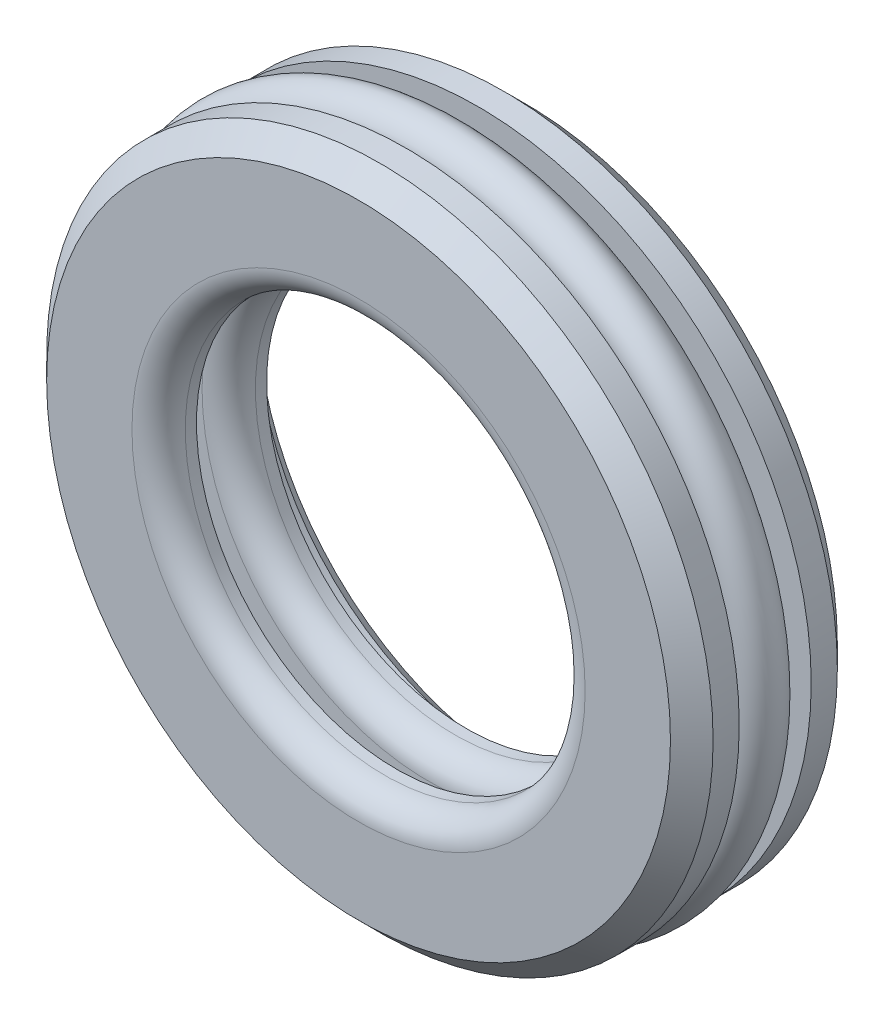
ISO-10303-21;
HEADER;
FILE_DESCRIPTION(('STEP AP214'),'2;1');
FILE_NAME('part.step','',(''),(''),'','','');
FILE_SCHEMA(('AUTOMOTIVE_DESIGN { 1 0 10303 214 1 1 1 1 }'));
ENDSEC;
DATA;
#1=APPLICATION_CONTEXT('core data for automotive mechanical design processes');
#2=APPLICATION_PROTOCOL_DEFINITION('international standard','automotive_design',2000,#1);
#3=PRODUCT_CONTEXT('',#1,'mechanical');
#4=PRODUCT('Part','Part','',(#3));
#5=PRODUCT_RELATED_PRODUCT_CATEGORY('part','',(#4));
#6=PRODUCT_DEFINITION_FORMATION('','',#4);
#7=PRODUCT_DEFINITION_CONTEXT('part definition',#1,'design');
#8=PRODUCT_DEFINITION('design','',#6,#7);
#9=PRODUCT_DEFINITION_SHAPE('','',#8);
#10=(LENGTH_UNIT() NAMED_UNIT(*) SI_UNIT(.MILLI.,.METRE.));
#11=(NAMED_UNIT(*) PLANE_ANGLE_UNIT() SI_UNIT($,.RADIAN.));
#12=(NAMED_UNIT(*) SI_UNIT($,.STERADIAN.) SOLID_ANGLE_UNIT());
#13=UNCERTAINTY_MEASURE_WITH_UNIT(LENGTH_MEASURE(1.E-05),#10,'distance_accuracy_value','');
#14=(GEOMETRIC_REPRESENTATION_CONTEXT(3) GLOBAL_UNCERTAINTY_ASSIGNED_CONTEXT((#13)) GLOBAL_UNIT_ASSIGNED_CONTEXT((#10,
#11,#12)) REPRESENTATION_CONTEXT('',''));
#15=CARTESIAN_POINT('',(0.,0.,0.));
#16=DIRECTION('',(0.,0.,1.));
#17=DIRECTION('',(1.,0.,0.));
#18=AXIS2_PLACEMENT_3D('',#15,#16,#17);
#19=CARTESIAN_POINT('',(0.,0.,0.));
#20=DIRECTION('',(0.,0.,1.));
#21=DIRECTION('',(1.,0.,0.));
#22=AXIS2_PLACEMENT_3D('',#19,#20,#21);
#23=TOROIDAL_SURFACE('',#22,14.9606,1.143);
#24=CARTESIAN_POINT('',(16.1036,0.,0.));
#25=VERTEX_POINT('',#24);
#26=VERTEX_LOOP('',#25);
#27=FACE_BOUND('',#26,.T.);
#28=ADVANCED_FACE('F45',(#27),#23,.T.);
#29=CLOSED_SHELL('',(#28));
#30=MANIFOLD_SOLID_BREP('B2',#29);
#31=CARTESIAN_POINT('',(0.,0.,3.9751));
#32=DIRECTION('',(0.,0.,1.));
#33=DIRECTION('',(1.,0.,0.));
#34=AXIS2_PLACEMENT_3D('',#31,#32,#33);
#35=CYLINDRICAL_SURFACE('',#34,15.875);
#36=CARTESIAN_POINT('',(0.,0.,2.9591));
#37=DIRECTION('',(0.,0.,1.));
#38=DIRECTION('',(1.,0.,0.));
#39=AXIS2_PLACEMENT_3D('',#36,#37,#38);
#40=CIRCLE('',#39,15.875);
#41=CARTESIAN_POINT('',(15.875,0.,2.9591));
#42=VERTEX_POINT('',#41);
#43=EDGE_CURVE('E44',#42,#42,#40,.T.);
#44=ORIENTED_EDGE('',*,*,#43,.F.);
#45=EDGE_LOOP('',(#44));
#46=FACE_BOUND('',#45,.T.);
#47=CARTESIAN_POINT('',(0.,0.,1.7145));
#48=DIRECTION('',(0.,0.,1.));
#49=DIRECTION('',(1.,0.,0.));
#50=AXIS2_PLACEMENT_3D('',#47,#48,#49);
#51=CIRCLE('',#50,15.875);
#52=CARTESIAN_POINT('',(15.875,0.,1.7145));
#53=VERTEX_POINT('',#52);
#54=EDGE_CURVE('E183',#53,#53,#51,.T.);
#55=ORIENTED_EDGE('',*,*,#54,.T.);
#56=EDGE_LOOP('',(#55));
#57=FACE_BOUND('',#56,.T.);
#58=ADVANCED_FACE('F58',(#46,#57),#35,.T.);
#59=CARTESIAN_POINT('',(0.,0.,2.9591));
#60=DIRECTION('',(0.,0.,-1.));
#61=DIRECTION('',(-1.,0.,0.));
#62=AXIS2_PLACEMENT_3D('',#59,#60,#61);
#63=CONICAL_SURFACE('',#62,15.875,0.785398163397443);
#64=CARTESIAN_POINT('',(0.,0.,3.9751));
#65=DIRECTION('',(0.,0.,1.));
#66=DIRECTION('',(1.,0.,0.));
#67=AXIS2_PLACEMENT_3D('',#64,#65,#66);
#68=CIRCLE('',#67,14.859);
#69=CARTESIAN_POINT('',(14.859,0.,3.9751));
#70=VERTEX_POINT('',#69);
#71=EDGE_CURVE('E65',#70,#70,#68,.T.);
#72=ORIENTED_EDGE('',*,*,#71,.F.);
#73=EDGE_LOOP('',(#72));
#74=FACE_BOUND('',#73,.T.);
#75=ORIENTED_EDGE('',*,*,#43,.T.);
#76=EDGE_LOOP('',(#75));
#77=FACE_BOUND('',#76,.T.);
#78=ADVANCED_FACE('F354',(#74,#77),#63,.T.);
#79=CARTESIAN_POINT('',(0.,14.859,3.9751));
#80=DIRECTION('',(0.,0.,-1.));
#81=DIRECTION('',(-1.,0.,0.));
#82=AXIS2_PLACEMENT_3D('',#79,#80,#81);
#83=PLANE('',#82);
#84=CARTESIAN_POINT('',(0.,0.,3.9751));
#85=DIRECTION('',(0.,0.,1.));
#86=DIRECTION('',(1.,0.,0.));
#87=AXIS2_PLACEMENT_3D('',#84,#85,#86);
#88=CIRCLE('',#87,10.795);
#89=CARTESIAN_POINT('',(10.795,0.,3.9751));
#90=VERTEX_POINT('',#89);
#91=EDGE_CURVE('E71',#90,#90,#88,.T.);
#92=ORIENTED_EDGE('',*,*,#91,.F.);
#93=EDGE_LOOP('',(#92));
#94=FACE_BOUND('',#93,.T.);
#95=ORIENTED_EDGE('',*,*,#71,.T.);
#96=EDGE_LOOP('',(#95));
#97=FACE_BOUND('',#96,.T.);
#98=ADVANCED_FACE('F349',(#94,#97),#83,.F.);
#99=CARTESIAN_POINT('',(0.,0.,2.7051));
#100=DIRECTION('',(0.,0.,1.));
#101=DIRECTION('',(1.,0.,0.));
#102=AXIS2_PLACEMENT_3D('',#99,#100,#101);
#103=TOROIDAL_SURFACE('',#102,10.795,1.27);
#104=CARTESIAN_POINT('',(0.,0.,2.7051));
#105=DIRECTION('',(0.,0.,1.));
#106=DIRECTION('',(1.,0.,0.));
#107=AXIS2_PLACEMENT_3D('',#104,#105,#106);
#108=CIRCLE('',#107,9.525);
#109=CARTESIAN_POINT('',(9.525,0.,2.7051));
#110=VERTEX_POINT('',#109);
#111=EDGE_CURVE('E77',#110,#110,#108,.T.);
#112=ORIENTED_EDGE('',*,*,#111,.F.);
#113=EDGE_LOOP('',(#112));
#114=FACE_BOUND('',#113,.T.);
#115=ORIENTED_EDGE('',*,*,#91,.T.);
#116=EDGE_LOOP('',(#115));
#117=FACE_BOUND('',#116,.T.);
#118=ADVANCED_FACE('F343',(#114,#117),#103,.T.);
#119=CARTESIAN_POINT('',(0.,0.,3.9751));
#120=DIRECTION('',(0.,0.,1.));
#121=DIRECTION('',(1.,0.,0.));
#122=AXIS2_PLACEMENT_3D('',#119,#120,#121);
#123=CYLINDRICAL_SURFACE('',#122,9.525);
#124=CARTESIAN_POINT('',(0.,0.,2.1717));
#125=DIRECTION('',(0.,0.,1.));
#126=DIRECTION('',(1.,0.,0.));
#127=AXIS2_PLACEMENT_3D('',#124,#125,#126);
#128=CIRCLE('',#127,9.525);
#129=CARTESIAN_POINT('',(9.525,0.,2.1717));
#130=VERTEX_POINT('',#129);
#131=EDGE_CURVE('E83',#130,#130,#128,.T.);
#132=ORIENTED_EDGE('',*,*,#131,.F.);
#133=EDGE_LOOP('',(#132));
#134=FACE_BOUND('',#133,.T.);
#135=ORIENTED_EDGE('',*,*,#111,.T.);
#136=EDGE_LOOP('',(#135));
#137=FACE_BOUND('',#136,.T.);
#138=ADVANCED_FACE('F337',(#134,#137),#123,.F.);
#139=CARTESIAN_POINT('',(0.,9.525,2.1717));
#140=DIRECTION('',(0.,0.,1.));
#141=DIRECTION('',(1.,0.,0.));
#142=AXIS2_PLACEMENT_3D('',#139,#140,#141);
#143=PLANE('',#142);
#144=CARTESIAN_POINT('',(0.,0.,2.1717));
#145=DIRECTION('',(0.,0.,1.));
#146=DIRECTION('',(1.,0.,0.));
#147=AXIS2_PLACEMENT_3D('',#144,#145,#146);
#148=CIRCLE('',#147,10.16);
#149=CARTESIAN_POINT('',(10.16,0.,2.1717));
#150=VERTEX_POINT('',#149);
#151=EDGE_CURVE('E87',#150,#150,#148,.T.);
#152=ORIENTED_EDGE('',*,*,#151,.F.);
#153=EDGE_LOOP('',(#152));
#154=FACE_BOUND('',#153,.T.);
#155=ORIENTED_EDGE('',*,*,#131,.T.);
#156=EDGE_LOOP('',(#155));
#157=FACE_BOUND('',#156,.T.);
#158=ADVANCED_FACE('F331',(#154,#157),#143,.F.);
#159=CARTESIAN_POINT('',(0.,0.,3.9751));
#160=DIRECTION('',(0.,0.,1.));
#161=DIRECTION('',(1.,0.,0.));
#162=AXIS2_PLACEMENT_3D('',#159,#160,#161);
#163=CYLINDRICAL_SURFACE('',#162,10.16);
#164=CARTESIAN_POINT('',(0.,0.,2.7051));
#165=DIRECTION('',(0.,0.,1.));
#166=DIRECTION('',(1.,0.,0.));
#167=AXIS2_PLACEMENT_3D('',#164,#165,#166);
#168=CIRCLE('',#167,10.16);
#169=CARTESIAN_POINT('',(10.16,0.,2.7051));
#170=VERTEX_POINT('',#169);
#171=EDGE_CURVE('E91',#170,#170,#168,.T.);
#172=ORIENTED_EDGE('',*,*,#171,.F.);
#173=EDGE_LOOP('',(#172));
#174=FACE_BOUND('',#173,.T.);
#175=ORIENTED_EDGE('',*,*,#151,.T.);
#176=EDGE_LOOP('',(#175));
#177=FACE_BOUND('',#176,.T.);
#178=ADVANCED_FACE('F325',(#174,#177),#163,.T.);
#179=CARTESIAN_POINT('',(0.,0.,2.7051));
#180=DIRECTION('',(0.,0.,1.));
#181=DIRECTION('',(1.,0.,0.));
#182=AXIS2_PLACEMENT_3D('',#179,#180,#181);
#183=TOROIDAL_SURFACE('',#182,10.795,0.634999999999999);
#184=CARTESIAN_POINT('',(0.,0.,3.3401));
#185=DIRECTION('',(0.,0.,1.));
#186=DIRECTION('',(1.,0.,0.));
#187=AXIS2_PLACEMENT_3D('',#184,#185,#186);
#188=CIRCLE('',#187,10.795);
#189=CARTESIAN_POINT('',(10.795,0.,3.3401));
#190=VERTEX_POINT('',#189);
#191=EDGE_CURVE('E95',#190,#190,#188,.T.);
#192=ORIENTED_EDGE('',*,*,#191,.F.);
#193=EDGE_LOOP('',(#192));
#194=FACE_BOUND('',#193,.T.);
#195=ORIENTED_EDGE('',*,*,#171,.T.);
#196=EDGE_LOOP('',(#195));
#197=FACE_BOUND('',#196,.T.);
#198=ADVANCED_FACE('F319',(#194,#197),#183,.F.);
#199=CARTESIAN_POINT('',(0.,10.795,3.3401));
#200=DIRECTION('',(0.,0.,1.));
#201=DIRECTION('',(1.,0.,0.));
#202=AXIS2_PLACEMENT_3D('',#199,#200,#201);
#203=PLANE('',#202);
#204=CARTESIAN_POINT('',(0.,0.,3.3401));
#205=DIRECTION('',(0.,0.,1.));
#206=DIRECTION('',(1.,0.,0.));
#207=AXIS2_PLACEMENT_3D('',#204,#205,#206);
#208=CIRCLE('',#207,11.7475);
#209=CARTESIAN_POINT('',(11.7475,0.,3.3401));
#210=VERTEX_POINT('',#209);
#211=EDGE_CURVE('E99',#210,#210,#208,.T.);
#212=ORIENTED_EDGE('',*,*,#211,.F.);
#213=EDGE_LOOP('',(#212));
#214=FACE_BOUND('',#213,.T.);
#215=ORIENTED_EDGE('',*,*,#191,.T.);
#216=EDGE_LOOP('',(#215));
#217=FACE_BOUND('',#216,.T.);
#218=ADVANCED_FACE('F313',(#214,#217),#203,.F.);
#219=CARTESIAN_POINT('',(0.,0.,3.0861));
#220=DIRECTION('',(0.,0.,1.));
#221=DIRECTION('',(1.,0.,0.));
#222=AXIS2_PLACEMENT_3D('',#219,#220,#221);
#223=TOROIDAL_SURFACE('',#222,11.7475,0.254);
#224=CARTESIAN_POINT('',(0.,0.,3.0861));
#225=DIRECTION('',(0.,0.,1.));
#226=DIRECTION('',(1.,0.,0.));
#227=AXIS2_PLACEMENT_3D('',#224,#225,#226);
#228=CIRCLE('',#227,12.0015);
#229=CARTESIAN_POINT('',(12.0015,0.,3.0861));
#230=VERTEX_POINT('',#229);
#231=EDGE_CURVE('E103',#230,#230,#228,.T.);
#232=ORIENTED_EDGE('',*,*,#231,.F.);
#233=EDGE_LOOP('',(#232));
#234=FACE_BOUND('',#233,.T.);
#235=ORIENTED_EDGE('',*,*,#211,.T.);
#236=EDGE_LOOP('',(#235));
#237=FACE_BOUND('',#236,.T.);
#238=ADVANCED_FACE('F307',(#234,#237),#223,.F.);
#239=CARTESIAN_POINT('',(0.,0.,3.9751));
#240=DIRECTION('',(0.,0.,1.));
#241=DIRECTION('',(1.,0.,0.));
#242=AXIS2_PLACEMENT_3D('',#239,#240,#241);
#243=CYLINDRICAL_SURFACE('',#242,12.0015);
#244=CARTESIAN_POINT('',(0.,0.,0.888999999999999));
#245=DIRECTION('',(0.,0.,1.));
#246=DIRECTION('',(1.,0.,0.));
#247=AXIS2_PLACEMENT_3D('',#244,#245,#246);
#248=CIRCLE('',#247,12.0015);
#249=CARTESIAN_POINT('',(12.0015,0.,0.888999999999999));
#250=VERTEX_POINT('',#249);
#251=EDGE_CURVE('E107',#250,#250,#248,.T.);
#252=ORIENTED_EDGE('',*,*,#251,.F.);
#253=EDGE_LOOP('',(#252));
#254=FACE_BOUND('',#253,.T.);
#255=ORIENTED_EDGE('',*,*,#231,.T.);
#256=EDGE_LOOP('',(#255));
#257=FACE_BOUND('',#256,.T.);
#258=ADVANCED_FACE('F301',(#254,#257),#243,.F.);
#259=CARTESIAN_POINT('',(0.,0.,0.888999999999999));
#260=DIRECTION('',(0.,0.,1.));
#261=DIRECTION('',(1.,0.,0.));
#262=AXIS2_PLACEMENT_3D('',#259,#260,#261);
#263=TOROIDAL_SURFACE('',#262,11.7475,0.254);
#264=CARTESIAN_POINT('',(0.,0.,0.634999999999999));
#265=DIRECTION('',(0.,0.,1.));
#266=DIRECTION('',(1.,0.,0.));
#267=AXIS2_PLACEMENT_3D('',#264,#265,#266);
#268=CIRCLE('',#267,11.7475);
#269=CARTESIAN_POINT('',(11.7475,0.,0.634999999999999));
#270=VERTEX_POINT('',#269);
#271=EDGE_CURVE('E111',#270,#270,#268,.T.);
#272=ORIENTED_EDGE('',*,*,#271,.F.);
#273=EDGE_LOOP('',(#272));
#274=FACE_BOUND('',#273,.T.);
#275=ORIENTED_EDGE('',*,*,#251,.T.);
#276=EDGE_LOOP('',(#275));
#277=FACE_BOUND('',#276,.T.);
#278=ADVANCED_FACE('F295',(#274,#277),#263,.F.);
#279=CARTESIAN_POINT('',(0.,10.795,0.634999999999999));
#280=DIRECTION('',(0.,0.,-1.));
#281=DIRECTION('',(-1.,0.,0.));
#282=AXIS2_PLACEMENT_3D('',#279,#280,#281);
#283=PLANE('',#282);
#284=CARTESIAN_POINT('',(0.,0.,0.634999999999999));
#285=DIRECTION('',(0.,0.,1.));
#286=DIRECTION('',(1.,0.,0.));
#287=AXIS2_PLACEMENT_3D('',#284,#285,#286);
#288=CIRCLE('',#287,10.795);
#289=CARTESIAN_POINT('',(10.795,0.,0.634999999999999));
#290=VERTEX_POINT('',#289);
#291=EDGE_CURVE('E115',#290,#290,#288,.T.);
#292=ORIENTED_EDGE('',*,*,#291,.F.);
#293=EDGE_LOOP('',(#292));
#294=FACE_BOUND('',#293,.T.);
#295=ORIENTED_EDGE('',*,*,#271,.T.);
#296=EDGE_LOOP('',(#295));
#297=FACE_BOUND('',#296,.T.);
#298=ADVANCED_FACE('F289',(#294,#297),#283,.F.);
#299=CARTESIAN_POINT('',(0.,0.,-0.635000000000001));
#300=DIRECTION('',(0.,0.,1.));
#301=DIRECTION('',(1.,0.,0.));
#302=AXIS2_PLACEMENT_3D('',#299,#300,#301);
#303=TOROIDAL_SURFACE('',#302,10.795,1.27);
#304=CARTESIAN_POINT('',(0.,0.,-0.635000000000001));
#305=DIRECTION('',(0.,0.,1.));
#306=DIRECTION('',(1.,0.,0.));
#307=AXIS2_PLACEMENT_3D('',#304,#305,#306);
#308=CIRCLE('',#307,9.525);
#309=CARTESIAN_POINT('',(9.525,0.,-0.635000000000001));
#310=VERTEX_POINT('',#309);
#311=EDGE_CURVE('E119',#310,#310,#308,.T.);
#312=ORIENTED_EDGE('',*,*,#311,.F.);
#313=EDGE_LOOP('',(#312));
#314=FACE_BOUND('',#313,.T.);
#315=ORIENTED_EDGE('',*,*,#291,.T.);
#316=EDGE_LOOP('',(#315));
#317=FACE_BOUND('',#316,.T.);
#318=ADVANCED_FACE('F283',(#314,#317),#303,.T.);
#319=CARTESIAN_POINT('',(0.,0.,3.9751));
#320=DIRECTION('',(0.,0.,1.));
#321=DIRECTION('',(1.,0.,0.));
#322=AXIS2_PLACEMENT_3D('',#319,#320,#321);
#323=CYLINDRICAL_SURFACE('',#322,9.525);
#324=CARTESIAN_POINT('',(0.,0.,-1.1684));
#325=DIRECTION('',(0.,0.,1.));
#326=DIRECTION('',(1.,0.,0.));
#327=AXIS2_PLACEMENT_3D('',#324,#325,#326);
#328=CIRCLE('',#327,9.525);
#329=CARTESIAN_POINT('',(9.525,0.,-1.1684));
#330=VERTEX_POINT('',#329);
#331=EDGE_CURVE('E123',#330,#330,#328,.T.);
#332=ORIENTED_EDGE('',*,*,#331,.F.);
#333=EDGE_LOOP('',(#332));
#334=FACE_BOUND('',#333,.T.);
#335=ORIENTED_EDGE('',*,*,#311,.T.);
#336=EDGE_LOOP('',(#335));
#337=FACE_BOUND('',#336,.T.);
#338=ADVANCED_FACE('F277',(#334,#337),#323,.F.);
#339=CARTESIAN_POINT('',(0.,10.16,-1.1684));
#340=DIRECTION('',(0.,0.,1.));
#341=DIRECTION('',(1.,0.,0.));
#342=AXIS2_PLACEMENT_3D('',#339,#340,#341);
#343=PLANE('',#342);
#344=CARTESIAN_POINT('',(0.,0.,-1.1684));
#345=DIRECTION('',(0.,0.,1.));
#346=DIRECTION('',(1.,0.,0.));
#347=AXIS2_PLACEMENT_3D('',#344,#345,#346);
#348=CIRCLE('',#347,10.16);
#349=CARTESIAN_POINT('',(10.16,0.,-1.1684));
#350=VERTEX_POINT('',#349);
#351=EDGE_CURVE('E127',#350,#350,#348,.T.);
#352=ORIENTED_EDGE('',*,*,#351,.F.);
#353=EDGE_LOOP('',(#352));
#354=FACE_BOUND('',#353,.T.);
#355=ORIENTED_EDGE('',*,*,#331,.T.);
#356=EDGE_LOOP('',(#355));
#357=FACE_BOUND('',#356,.T.);
#358=ADVANCED_FACE('F271',(#354,#357),#343,.F.);
#359=CARTESIAN_POINT('',(0.,0.,3.9751));
#360=DIRECTION('',(0.,0.,1.));
#361=DIRECTION('',(1.,0.,0.));
#362=AXIS2_PLACEMENT_3D('',#359,#360,#361);
#363=CYLINDRICAL_SURFACE('',#362,10.16);
#364=CARTESIAN_POINT('',(0.,0.,-0.635000000000001));
#365=DIRECTION('',(0.,0.,1.));
#366=DIRECTION('',(1.,0.,0.));
#367=AXIS2_PLACEMENT_3D('',#364,#365,#366);
#368=CIRCLE('',#367,10.16);
#369=CARTESIAN_POINT('',(10.16,0.,-0.635000000000001));
#370=VERTEX_POINT('',#369);
#371=EDGE_CURVE('E131',#370,#370,#368,.T.);
#372=ORIENTED_EDGE('',*,*,#371,.F.);
#373=EDGE_LOOP('',(#372));
#374=FACE_BOUND('',#373,.T.);
#375=ORIENTED_EDGE('',*,*,#351,.T.);
#376=EDGE_LOOP('',(#375));
#377=FACE_BOUND('',#376,.T.);
#378=ADVANCED_FACE('F265',(#374,#377),#363,.T.);
#379=CARTESIAN_POINT('',(0.,0.,-0.635000000000001));
#380=DIRECTION('',(0.,0.,1.));
#381=DIRECTION('',(1.,0.,0.));
#382=AXIS2_PLACEMENT_3D('',#379,#380,#381);
#383=TOROIDAL_SURFACE('',#382,10.795,0.635);
#384=CARTESIAN_POINT('',(0.,0.,0.));
#385=DIRECTION('',(0.,0.,1.));
#386=DIRECTION('',(1.,0.,0.));
#387=AXIS2_PLACEMENT_3D('',#384,#385,#386);
#388=CIRCLE('',#387,10.795);
#389=CARTESIAN_POINT('',(10.795,0.,0.));
#390=VERTEX_POINT('',#389);
#391=EDGE_CURVE('E135',#390,#390,#388,.T.);
#392=ORIENTED_EDGE('',*,*,#391,.F.);
#393=EDGE_LOOP('',(#392));
#394=FACE_BOUND('',#393,.T.);
#395=ORIENTED_EDGE('',*,*,#371,.T.);
#396=EDGE_LOOP('',(#395));
#397=FACE_BOUND('',#396,.T.);
#398=ADVANCED_FACE('F259',(#394,#397),#383,.F.);
#399=CARTESIAN_POINT('',(0.,11.7475,0.));
#400=DIRECTION('',(0.,0.,1.));
#401=DIRECTION('',(1.,0.,0.));
#402=AXIS2_PLACEMENT_3D('',#399,#400,#401);
#403=PLANE('',#402);
#404=CARTESIAN_POINT('',(0.,0.,0.));
#405=DIRECTION('',(0.,0.,1.));
#406=DIRECTION('',(1.,0.,0.));
#407=AXIS2_PLACEMENT_3D('',#404,#405,#406);
#408=CIRCLE('',#407,11.7475);
#409=CARTESIAN_POINT('',(11.7475,0.,0.));
#410=VERTEX_POINT('',#409);
#411=EDGE_CURVE('E139',#410,#410,#408,.T.);
#412=ORIENTED_EDGE('',*,*,#411,.F.);
#413=EDGE_LOOP('',(#412));
#414=FACE_BOUND('',#413,.T.);
#415=ORIENTED_EDGE('',*,*,#391,.T.);
#416=EDGE_LOOP('',(#415));
#417=FACE_BOUND('',#416,.T.);
#418=ADVANCED_FACE('F253',(#414,#417),#403,.F.);
#419=CARTESIAN_POINT('',(0.,0.,-0.254000000000001));
#420=DIRECTION('',(0.,0.,1.));
#421=DIRECTION('',(1.,0.,0.));
#422=AXIS2_PLACEMENT_3D('',#419,#420,#421);
#423=TOROIDAL_SURFACE('',#422,11.7475,0.254);
#424=CARTESIAN_POINT('',(0.,0.,-0.254000000000001));
#425=DIRECTION('',(0.,0.,1.));
#426=DIRECTION('',(1.,0.,0.));
#427=AXIS2_PLACEMENT_3D('',#424,#425,#426);
#428=CIRCLE('',#427,12.0015);
#429=CARTESIAN_POINT('',(12.0015,0.,-0.254000000000001));
#430=VERTEX_POINT('',#429);
#431=EDGE_CURVE('E143',#430,#430,#428,.T.);
#432=ORIENTED_EDGE('',*,*,#431,.F.);
#433=EDGE_LOOP('',(#432));
#434=FACE_BOUND('',#433,.T.);
#435=ORIENTED_EDGE('',*,*,#411,.T.);
#436=EDGE_LOOP('',(#435));
#437=FACE_BOUND('',#436,.T.);
#438=ADVANCED_FACE('F247',(#434,#437),#423,.F.);
#439=CARTESIAN_POINT('',(0.,0.,3.9751));
#440=DIRECTION('',(0.,0.,1.));
#441=DIRECTION('',(1.,0.,0.));
#442=AXIS2_PLACEMENT_3D('',#439,#440,#441);
#443=CYLINDRICAL_SURFACE('',#442,12.0015);
#444=CARTESIAN_POINT('',(0.,0.,-3.21310000000001));
#445=DIRECTION('',(0.,0.,1.));
#446=DIRECTION('',(1.,0.,0.));
#447=AXIS2_PLACEMENT_3D('',#444,#445,#446);
#448=CIRCLE('',#447,12.0015);
#449=CARTESIAN_POINT('',(12.0015,0.,-3.21310000000001));
#450=VERTEX_POINT('',#449);
#451=EDGE_CURVE('E147',#450,#450,#448,.T.);
#452=ORIENTED_EDGE('',*,*,#451,.F.);
#453=EDGE_LOOP('',(#452));
#454=FACE_BOUND('',#453,.T.);
#455=ORIENTED_EDGE('',*,*,#431,.T.);
#456=EDGE_LOOP('',(#455));
#457=FACE_BOUND('',#456,.T.);
#458=ADVANCED_FACE('F241',(#454,#457),#443,.F.);
#459=CARTESIAN_POINT('',(0.,0.,-3.21310000000001));
#460=DIRECTION('',(0.,0.,-1.));
#461=DIRECTION('',(-1.,0.,0.));
#462=AXIS2_PLACEMENT_3D('',#459,#460,#461);
#463=CONICAL_SURFACE('',#462,12.0015,0.785398163397453);
#464=CARTESIAN_POINT('',(0.,0.,-3.9751));
#465=DIRECTION('',(0.,0.,1.));
#466=DIRECTION('',(1.,0.,0.));
#467=AXIS2_PLACEMENT_3D('',#464,#465,#466);
#468=CIRCLE('',#467,12.7635);
#469=CARTESIAN_POINT('',(12.7635,0.,-3.9751));
#470=VERTEX_POINT('',#469);
#471=EDGE_CURVE('E151',#470,#470,#468,.T.);
#472=ORIENTED_EDGE('',*,*,#471,.F.);
#473=EDGE_LOOP('',(#472));
#474=FACE_BOUND('',#473,.T.);
#475=ORIENTED_EDGE('',*,*,#451,.T.);
#476=EDGE_LOOP('',(#475));
#477=FACE_BOUND('',#476,.T.);
#478=ADVANCED_FACE('F235',(#474,#477),#463,.F.);
#479=CARTESIAN_POINT('',(0.,14.859,-3.9751));
#480=DIRECTION('',(0.,0.,1.));
#481=DIRECTION('',(1.,0.,0.));
#482=AXIS2_PLACEMENT_3D('',#479,#480,#481);
#483=PLANE('',#482);
#484=CARTESIAN_POINT('',(0.,0.,-3.9751));
#485=DIRECTION('',(0.,0.,1.));
#486=DIRECTION('',(1.,0.,0.));
#487=AXIS2_PLACEMENT_3D('',#484,#485,#486);
#488=CIRCLE('',#487,14.859);
#489=CARTESIAN_POINT('',(14.859,0.,-3.9751));
#490=VERTEX_POINT('',#489);
#491=EDGE_CURVE('E155',#490,#490,#488,.T.);
#492=ORIENTED_EDGE('',*,*,#491,.F.);
#493=EDGE_LOOP('',(#492));
#494=FACE_BOUND('',#493,.T.);
#495=ORIENTED_EDGE('',*,*,#471,.T.);
#496=EDGE_LOOP('',(#495));
#497=FACE_BOUND('',#496,.T.);
#498=ADVANCED_FACE('F229',(#494,#497),#483,.F.);
#499=CARTESIAN_POINT('',(0.,0.,-3.9751));
#500=DIRECTION('',(0.,0.,1.));
#501=DIRECTION('',(1.,0.,0.));
#502=AXIS2_PLACEMENT_3D('',#499,#500,#501);
#503=CONICAL_SURFACE('',#502,14.859,0.785398163397443);
#504=CARTESIAN_POINT('',(0.,0.,-2.9591));
#505=DIRECTION('',(0.,0.,1.));
#506=DIRECTION('',(1.,0.,0.));
#507=AXIS2_PLACEMENT_3D('',#504,#505,#506);
#508=CIRCLE('',#507,15.875);
#509=CARTESIAN_POINT('',(15.875,0.,-2.9591));
#510=VERTEX_POINT('',#509);
#511=EDGE_CURVE('E159',#510,#510,#508,.T.);
#512=ORIENTED_EDGE('',*,*,#511,.F.);
#513=EDGE_LOOP('',(#512));
#514=FACE_BOUND('',#513,.T.);
#515=ORIENTED_EDGE('',*,*,#491,.T.);
#516=EDGE_LOOP('',(#515));
#517=FACE_BOUND('',#516,.T.);
#518=ADVANCED_FACE('F223',(#514,#517),#503,.T.);
#519=CARTESIAN_POINT('',(0.,0.,3.9751));
#520=DIRECTION('',(0.,0.,1.));
#521=DIRECTION('',(1.,0.,0.));
#522=AXIS2_PLACEMENT_3D('',#519,#520,#521);
#523=CYLINDRICAL_SURFACE('',#522,15.875);
#524=CARTESIAN_POINT('',(0.,0.,-1.7145));
#525=DIRECTION('',(0.,0.,1.));
#526=DIRECTION('',(1.,0.,0.));
#527=AXIS2_PLACEMENT_3D('',#524,#525,#526);
#528=CIRCLE('',#527,15.875);
#529=CARTESIAN_POINT('',(15.875,0.,-1.7145));
#530=VERTEX_POINT('',#529);
#531=EDGE_CURVE('E163',#530,#530,#528,.T.);
#532=ORIENTED_EDGE('',*,*,#531,.F.);
#533=EDGE_LOOP('',(#532));
#534=FACE_BOUND('',#533,.T.);
#535=ORIENTED_EDGE('',*,*,#511,.T.);
#536=EDGE_LOOP('',(#535));
#537=FACE_BOUND('',#536,.T.);
#538=ADVANCED_FACE('F217',(#534,#537),#523,.T.);
#539=CARTESIAN_POINT('',(0.,15.875,-1.7145));
#540=DIRECTION('',(0.,0.,-1.));
#541=DIRECTION('',(-1.,0.,0.));
#542=AXIS2_PLACEMENT_3D('',#539,#540,#541);
#543=PLANE('',#542);
#544=CARTESIAN_POINT('',(0.,0.,-1.7145));
#545=DIRECTION('',(0.,0.,1.));
#546=DIRECTION('',(1.,0.,0.));
#547=AXIS2_PLACEMENT_3D('',#544,#545,#546);
#548=CIRCLE('',#547,14.4526);
#549=CARTESIAN_POINT('',(14.4526,0.,-1.7145));
#550=VERTEX_POINT('',#549);
#551=EDGE_CURVE('E167',#550,#550,#548,.T.);
#552=ORIENTED_EDGE('',*,*,#551,.F.);
#553=EDGE_LOOP('',(#552));
#554=FACE_BOUND('',#553,.T.);
#555=ORIENTED_EDGE('',*,*,#531,.T.);
#556=EDGE_LOOP('',(#555));
#557=FACE_BOUND('',#556,.T.);
#558=ADVANCED_FACE('F211',(#554,#557),#543,.F.);
#559=CARTESIAN_POINT('',(0.,0.,-1.0795));
#560=DIRECTION('',(0.,0.,1.));
#561=DIRECTION('',(1.,0.,0.));
#562=AXIS2_PLACEMENT_3D('',#559,#560,#561);
#563=TOROIDAL_SURFACE('',#562,14.4526,0.635);
#564=CARTESIAN_POINT('',(0.,0.,-1.0795));
#565=DIRECTION('',(0.,0.,1.));
#566=DIRECTION('',(1.,0.,0.));
#567=AXIS2_PLACEMENT_3D('',#564,#565,#566);
#568=CIRCLE('',#567,13.8176);
#569=CARTESIAN_POINT('',(13.8176,0.,-1.0795));
#570=VERTEX_POINT('',#569);
#571=EDGE_CURVE('E171',#570,#570,#568,.T.);
#572=ORIENTED_EDGE('',*,*,#571,.F.);
#573=EDGE_LOOP('',(#572));
#574=FACE_BOUND('',#573,.T.);
#575=ORIENTED_EDGE('',*,*,#551,.T.);
#576=EDGE_LOOP('',(#575));
#577=FACE_BOUND('',#576,.T.);
#578=ADVANCED_FACE('F205',(#574,#577),#563,.F.);
#579=CARTESIAN_POINT('',(0.,0.,3.9751));
#580=DIRECTION('',(0.,0.,1.));
#581=DIRECTION('',(1.,0.,0.));
#582=AXIS2_PLACEMENT_3D('',#579,#580,#581);
#583=CYLINDRICAL_SURFACE('',#582,13.8176);
#584=CARTESIAN_POINT('',(0.,0.,1.0795));
#585=DIRECTION('',(0.,0.,1.));
#586=DIRECTION('',(1.,0.,0.));
#587=AXIS2_PLACEMENT_3D('',#584,#585,#586);
#588=CIRCLE('',#587,13.8176);
#589=CARTESIAN_POINT('',(13.8176,0.,1.0795));
#590=VERTEX_POINT('',#589);
#591=EDGE_CURVE('E175',#590,#590,#588,.T.);
#592=ORIENTED_EDGE('',*,*,#591,.F.);
#593=EDGE_LOOP('',(#592));
#594=FACE_BOUND('',#593,.T.);
#595=ORIENTED_EDGE('',*,*,#571,.T.);
#596=EDGE_LOOP('',(#595));
#597=FACE_BOUND('',#596,.T.);
#598=ADVANCED_FACE('F199',(#594,#597),#583,.T.);
#599=CARTESIAN_POINT('',(0.,0.,1.0795));
#600=DIRECTION('',(0.,0.,1.));
#601=DIRECTION('',(1.,0.,0.));
#602=AXIS2_PLACEMENT_3D('',#599,#600,#601);
#603=TOROIDAL_SURFACE('',#602,14.4526,0.635);
#604=CARTESIAN_POINT('',(0.,0.,1.7145));
#605=DIRECTION('',(0.,0.,1.));
#606=DIRECTION('',(1.,0.,0.));
#607=AXIS2_PLACEMENT_3D('',#604,#605,#606);
#608=CIRCLE('',#607,14.4526);
#609=CARTESIAN_POINT('',(14.4526,0.,1.7145));
#610=VERTEX_POINT('',#609);
#611=EDGE_CURVE('E179',#610,#610,#608,.T.);
#612=ORIENTED_EDGE('',*,*,#611,.F.);
#613=EDGE_LOOP('',(#612));
#614=FACE_BOUND('',#613,.T.);
#615=ORIENTED_EDGE('',*,*,#591,.T.);
#616=EDGE_LOOP('',(#615));
#617=FACE_BOUND('',#616,.T.);
#618=ADVANCED_FACE('F193',(#614,#617),#603,.F.);
#619=CARTESIAN_POINT('',(0.,15.875,1.7145));
#620=DIRECTION('',(0.,0.,1.));
#621=DIRECTION('',(1.,0.,0.));
#622=AXIS2_PLACEMENT_3D('',#619,#620,#621);
#623=PLANE('',#622);
#624=ORIENTED_EDGE('',*,*,#54,.F.);
#625=EDGE_LOOP('',(#624));
#626=FACE_BOUND('',#625,.T.);
#627=ORIENTED_EDGE('',*,*,#611,.T.);
#628=EDGE_LOOP('',(#627));
#629=FACE_BOUND('',#628,.T.);
#630=ADVANCED_FACE('F190',(#626,#629),#623,.F.);
#631=CLOSED_SHELL('',(#58,#78,#98,#118,#138,#158,#178,#198,#218,#238,#258,#278,#298,#318,#338,
#358,#378,#398,#418,#438,#458,#478,#498,#518,#538,#558,#578,#598,#618,#630));
#632=MANIFOLD_SOLID_BREP('B6',#631);
#633=ADVANCED_BREP_SHAPE_REPRESENTATION('',(#18,#30,#632),#14);
#634=SHAPE_DEFINITION_REPRESENTATION(#9,#633);
ENDSEC;
END-ISO-10303-21;
